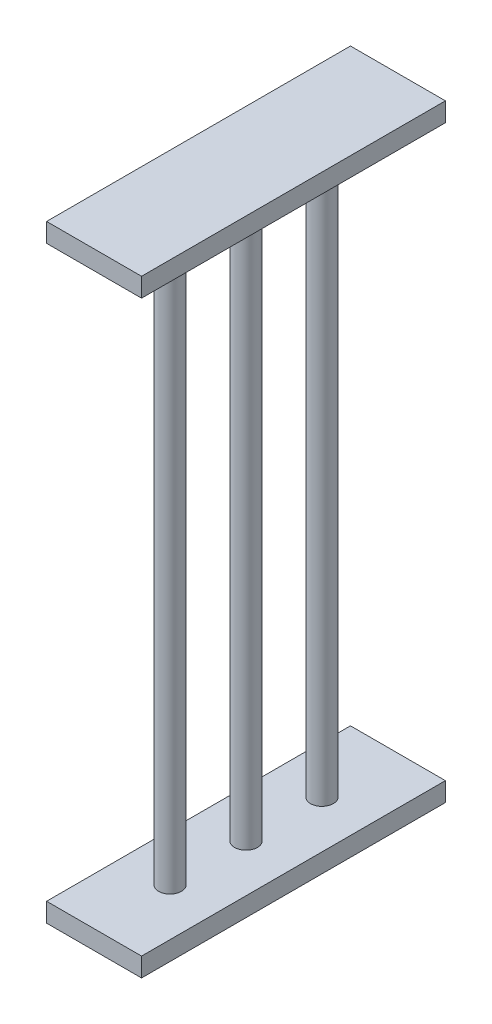
ISO-10303-21;
HEADER;
FILE_DESCRIPTION(('STEP AP214'),'2;1');
FILE_NAME('part.step','',(''),(''),'','','');
FILE_SCHEMA(('AUTOMOTIVE_DESIGN { 1 0 10303 214 1 1 1 1 }'));
ENDSEC;
DATA;
#1=APPLICATION_CONTEXT('core data for automotive mechanical design processes');
#2=APPLICATION_PROTOCOL_DEFINITION('international standard','automotive_design',2000,#1);
#3=PRODUCT_CONTEXT('',#1,'mechanical');
#4=PRODUCT('Part','Part','',(#3));
#5=PRODUCT_RELATED_PRODUCT_CATEGORY('part','',(#4));
#6=PRODUCT_DEFINITION_FORMATION('','',#4);
#7=PRODUCT_DEFINITION_CONTEXT('part definition',#1,'design');
#8=PRODUCT_DEFINITION('design','',#6,#7);
#9=PRODUCT_DEFINITION_SHAPE('','',#8);
#10=(LENGTH_UNIT() NAMED_UNIT(*) SI_UNIT(.MILLI.,.METRE.));
#11=(NAMED_UNIT(*) PLANE_ANGLE_UNIT() SI_UNIT($,.RADIAN.));
#12=(NAMED_UNIT(*) SI_UNIT($,.STERADIAN.) SOLID_ANGLE_UNIT());
#13=UNCERTAINTY_MEASURE_WITH_UNIT(LENGTH_MEASURE(1.E-05),#10,'distance_accuracy_value','');
#14=(GEOMETRIC_REPRESENTATION_CONTEXT(3) GLOBAL_UNCERTAINTY_ASSIGNED_CONTEXT((#13)) GLOBAL_UNIT_ASSIGNED_CONTEXT((#10,
#11,#12)) REPRESENTATION_CONTEXT('',''));
#15=CARTESIAN_POINT('',(0.,0.,0.));
#16=DIRECTION('',(0.,0.,1.));
#17=DIRECTION('',(1.,0.,0.));
#18=AXIS2_PLACEMENT_3D('',#15,#16,#17);
#19=CARTESIAN_POINT('',(0.,10.,0.));
#20=DIRECTION('',(-1.,0.,0.));
#21=DIRECTION('',(0.,0.,1.));
#22=AXIS2_PLACEMENT_3D('',#19,#20,#21);
#23=PLANE('',#22);
#24=DIRECTION('',(0.,0.,-1.));
#25=VECTOR('',#24,1.);
#26=CARTESIAN_POINT('',(0.,0.,0.));
#27=LINE('',#26,#25);
#28=CARTESIAN_POINT('',(0.,0.,0.));
#29=VERTEX_POINT('',#28);
#30=CARTESIAN_POINT('',(0.,0.,-160.));
#31=VERTEX_POINT('',#30);
#32=EDGE_CURVE('E153',#29,#31,#27,.T.);
#33=ORIENTED_EDGE('',*,*,#32,.T.);
#34=DIRECTION('',(0.,-1.,0.));
#35=VECTOR('',#34,1.);
#36=CARTESIAN_POINT('',(0.,10.,-160.));
#37=LINE('',#36,#35);
#38=CARTESIAN_POINT('',(0.,10.,-160.));
#39=VERTEX_POINT('',#38);
#40=EDGE_CURVE('E11',#39,#31,#37,.T.);
#41=ORIENTED_EDGE('',*,*,#40,.F.);
#42=DIRECTION('',(0.,0.,-1.));
#43=VECTOR('',#42,1.);
#44=CARTESIAN_POINT('',(0.,10.,0.));
#45=LINE('',#44,#43);
#46=CARTESIAN_POINT('',(0.,10.,0.));
#47=VERTEX_POINT('',#46);
#48=EDGE_CURVE('E156',#47,#39,#45,.T.);
#49=ORIENTED_EDGE('',*,*,#48,.F.);
#50=DIRECTION('',(0.,-1.,0.));
#51=VECTOR('',#50,1.);
#52=CARTESIAN_POINT('',(0.,10.,0.));
#53=LINE('',#52,#51);
#54=EDGE_CURVE('E162',#47,#29,#53,.T.);
#55=ORIENTED_EDGE('',*,*,#54,.T.);
#56=EDGE_LOOP('',(#33,#41,#49,#55));
#57=FACE_BOUND('',#56,.T.);
#58=ADVANCED_FACE('F33',(#57),#23,.F.);
#59=CARTESIAN_POINT('',(0.,10.,-160.));
#60=DIRECTION('',(0.,0.,1.));
#61=DIRECTION('',(1.,0.,0.));
#62=AXIS2_PLACEMENT_3D('',#59,#60,#61);
#63=PLANE('',#62);
#64=DIRECTION('',(-1.,0.,0.));
#65=VECTOR('',#64,1.);
#66=CARTESIAN_POINT('',(0.,0.,-160.));
#67=LINE('',#66,#65);
#68=CARTESIAN_POINT('',(-50.,0.,-160.));
#69=VERTEX_POINT('',#68);
#70=EDGE_CURVE('E165',#31,#69,#67,.T.);
#71=ORIENTED_EDGE('',*,*,#70,.T.);
#72=DIRECTION('',(0.,-1.,0.));
#73=VECTOR('',#72,1.);
#74=CARTESIAN_POINT('',(-50.,10.,-160.));
#75=LINE('',#74,#73);
#76=CARTESIAN_POINT('',(-50.,10.,-160.));
#77=VERTEX_POINT('',#76);
#78=EDGE_CURVE('E41',#77,#69,#75,.T.);
#79=ORIENTED_EDGE('',*,*,#78,.F.);
#80=DIRECTION('',(-1.,0.,0.));
#81=VECTOR('',#80,1.);
#82=CARTESIAN_POINT('',(0.,10.,-160.));
#83=LINE('',#82,#81);
#84=EDGE_CURVE('E80',#39,#77,#83,.T.);
#85=ORIENTED_EDGE('',*,*,#84,.F.);
#86=ORIENTED_EDGE('',*,*,#40,.T.);
#87=EDGE_LOOP('',(#71,#79,#85,#86));
#88=FACE_BOUND('',#87,.T.);
#89=ADVANCED_FACE('F189',(#88),#63,.F.);
#90=CARTESIAN_POINT('',(-50.,10.,0.));
#91=DIRECTION('',(1.,0.,0.));
#92=DIRECTION('',(0.,0.,-1.));
#93=AXIS2_PLACEMENT_3D('',#90,#91,#92);
#94=PLANE('',#93);
#95=DIRECTION('',(0.,0.,1.));
#96=VECTOR('',#95,1.);
#97=CARTESIAN_POINT('',(-50.,0.,0.));
#98=LINE('',#97,#96);
#99=CARTESIAN_POINT('',(-50.,0.,0.));
#100=VERTEX_POINT('',#99);
#101=EDGE_CURVE('E67',#69,#100,#98,.T.);
#102=ORIENTED_EDGE('',*,*,#101,.T.);
#103=DIRECTION('',(0.,-1.,0.));
#104=VECTOR('',#103,1.);
#105=CARTESIAN_POINT('',(-50.,10.,0.));
#106=LINE('',#105,#104);
#107=CARTESIAN_POINT('',(-50.,10.,0.));
#108=VERTEX_POINT('',#107);
#109=EDGE_CURVE('E170',#108,#100,#106,.T.);
#110=ORIENTED_EDGE('',*,*,#109,.F.);
#111=DIRECTION('',(0.,0.,1.));
#112=VECTOR('',#111,1.);
#113=CARTESIAN_POINT('',(-50.,10.,0.));
#114=LINE('',#113,#112);
#115=EDGE_CURVE('E159',#77,#108,#114,.T.);
#116=ORIENTED_EDGE('',*,*,#115,.F.);
#117=ORIENTED_EDGE('',*,*,#78,.T.);
#118=EDGE_LOOP('',(#102,#110,#116,#117));
#119=FACE_BOUND('',#118,.T.);
#120=ADVANCED_FACE('F172',(#119),#94,.F.);
#121=CARTESIAN_POINT('',(0.,10.,0.));
#122=DIRECTION('',(0.,0.,-1.));
#123=DIRECTION('',(-1.,0.,0.));
#124=AXIS2_PLACEMENT_3D('',#121,#122,#123);
#125=PLANE('',#124);
#126=DIRECTION('',(1.,0.,0.));
#127=VECTOR('',#126,1.);
#128=CARTESIAN_POINT('',(0.,0.,0.));
#129=LINE('',#128,#127);
#130=EDGE_CURVE('E73',#100,#29,#129,.T.);
#131=ORIENTED_EDGE('',*,*,#130,.T.);
#132=ORIENTED_EDGE('',*,*,#54,.F.);
#133=DIRECTION('',(1.,0.,0.));
#134=VECTOR('',#133,1.);
#135=CARTESIAN_POINT('',(0.,10.,0.));
#136=LINE('',#135,#134);
#137=EDGE_CURVE('E49',#108,#47,#136,.T.);
#138=ORIENTED_EDGE('',*,*,#137,.F.);
#139=ORIENTED_EDGE('',*,*,#109,.T.);
#140=EDGE_LOOP('',(#131,#132,#138,#139));
#141=FACE_BOUND('',#140,.T.);
#142=ADVANCED_FACE('F179',(#141),#125,.F.);
#143=CARTESIAN_POINT('',(0.,10.,0.));
#144=DIRECTION('',(0.,1.,0.));
#145=DIRECTION('',(0.,0.,1.));
#146=AXIS2_PLACEMENT_3D('',#143,#144,#145);
#147=PLANE('',#146);
#148=CARTESIAN_POINT('',(-25.,10.,-40.));
#149=DIRECTION('',(0.,1.,0.));
#150=DIRECTION('',(0.,0.,1.));
#151=AXIS2_PLACEMENT_3D('',#148,#149,#150);
#152=CIRCLE('',#151,6.);
#153=CARTESIAN_POINT('',(-25.,10.,-34.));
#154=VERTEX_POINT('',#153);
#155=EDGE_CURVE('E132',#154,#154,#152,.T.);
#156=ORIENTED_EDGE('',*,*,#155,.F.);
#157=EDGE_LOOP('',(#156));
#158=FACE_BOUND('',#157,.T.);
#159=CARTESIAN_POINT('',(-25.,10.,-80.));
#160=DIRECTION('',(0.,1.,0.));
#161=DIRECTION('',(0.,0.,1.));
#162=AXIS2_PLACEMENT_3D('',#159,#160,#161);
#163=CIRCLE('',#162,6.);
#164=CARTESIAN_POINT('',(-25.,10.,-74.));
#165=VERTEX_POINT('',#164);
#166=EDGE_CURVE('E142',#165,#165,#163,.T.);
#167=ORIENTED_EDGE('',*,*,#166,.F.);
#168=EDGE_LOOP('',(#167));
#169=FACE_BOUND('',#168,.T.);
#170=CARTESIAN_POINT('',(-25.,10.,-120.));
#171=DIRECTION('',(0.,1.,0.));
#172=DIRECTION('',(0.,0.,1.));
#173=AXIS2_PLACEMENT_3D('',#170,#171,#172);
#174=CIRCLE('',#173,6.);
#175=CARTESIAN_POINT('',(-25.,10.,-114.));
#176=VERTEX_POINT('',#175);
#177=EDGE_CURVE('E147',#176,#176,#174,.T.);
#178=ORIENTED_EDGE('',*,*,#177,.F.);
#179=EDGE_LOOP('',(#178));
#180=FACE_BOUND('',#179,.T.);
#181=ORIENTED_EDGE('',*,*,#48,.T.);
#182=ORIENTED_EDGE('',*,*,#84,.T.);
#183=ORIENTED_EDGE('',*,*,#115,.T.);
#184=ORIENTED_EDGE('',*,*,#137,.T.);
#185=EDGE_LOOP('',(#181,#182,#183,#184));
#186=FACE_BOUND('',#185,.T.);
#187=ADVANCED_FACE('F181',(#158,#169,#180,#186),#147,.T.);
#188=CARTESIAN_POINT('',(0.,0.,0.));
#189=DIRECTION('',(0.,1.,0.));
#190=DIRECTION('',(0.,0.,1.));
#191=AXIS2_PLACEMENT_3D('',#188,#189,#190);
#192=PLANE('',#191);
#193=ORIENTED_EDGE('',*,*,#32,.F.);
#194=ORIENTED_EDGE('',*,*,#130,.F.);
#195=ORIENTED_EDGE('',*,*,#101,.F.);
#196=ORIENTED_EDGE('',*,*,#70,.F.);
#197=EDGE_LOOP('',(#193,#194,#195,#196));
#198=FACE_BOUND('',#197,.T.);
#199=ADVANCED_FACE('F175',(#198),#192,.F.);
#200=CARTESIAN_POINT('',(-25.,310.,-120.));
#201=DIRECTION('',(0.,-1.,0.));
#202=DIRECTION('',(0.,0.,-1.));
#203=AXIS2_PLACEMENT_3D('',#200,#201,#202);
#204=CYLINDRICAL_SURFACE('',#203,6.);
#205=CARTESIAN_POINT('',(-25.,310.,-120.));
#206=DIRECTION('',(0.,1.,0.));
#207=DIRECTION('',(0.,0.,1.));
#208=AXIS2_PLACEMENT_3D('',#205,#206,#207);
#209=CIRCLE('',#208,6.);
#210=CARTESIAN_POINT('',(-25.,310.,-114.));
#211=VERTEX_POINT('',#210);
#212=EDGE_CURVE('E150',#211,#211,#209,.T.);
#213=ORIENTED_EDGE('',*,*,#212,.F.);
#214=EDGE_LOOP('',(#213));
#215=FACE_BOUND('',#214,.T.);
#216=ORIENTED_EDGE('',*,*,#177,.T.);
#217=EDGE_LOOP('',(#216));
#218=FACE_BOUND('',#217,.T.);
#219=ADVANCED_FACE('F216',(#215,#218),#204,.T.);
#220=CARTESIAN_POINT('',(-25.,310.,-80.));
#221=DIRECTION('',(0.,-1.,0.));
#222=DIRECTION('',(0.,0.,-1.));
#223=AXIS2_PLACEMENT_3D('',#220,#221,#222);
#224=CYLINDRICAL_SURFACE('',#223,6.);
#225=CARTESIAN_POINT('',(-25.,310.,-80.));
#226=DIRECTION('',(0.,1.,0.));
#227=DIRECTION('',(0.,0.,1.));
#228=AXIS2_PLACEMENT_3D('',#225,#226,#227);
#229=CIRCLE('',#228,6.);
#230=CARTESIAN_POINT('',(-25.,310.,-74.));
#231=VERTEX_POINT('',#230);
#232=EDGE_CURVE('E144',#231,#231,#229,.T.);
#233=ORIENTED_EDGE('',*,*,#232,.F.);
#234=EDGE_LOOP('',(#233));
#235=FACE_BOUND('',#234,.T.);
#236=ORIENTED_EDGE('',*,*,#166,.T.);
#237=EDGE_LOOP('',(#236));
#238=FACE_BOUND('',#237,.T.);
#239=ADVANCED_FACE('F229',(#235,#238),#224,.T.);
#240=CARTESIAN_POINT('',(-25.,310.,-40.));
#241=DIRECTION('',(0.,-1.,0.));
#242=DIRECTION('',(0.,0.,-1.));
#243=AXIS2_PLACEMENT_3D('',#240,#241,#242);
#244=CYLINDRICAL_SURFACE('',#243,6.);
#245=CARTESIAN_POINT('',(-25.,310.,-40.));
#246=DIRECTION('',(0.,1.,0.));
#247=DIRECTION('',(0.,0.,1.));
#248=AXIS2_PLACEMENT_3D('',#245,#246,#247);
#249=CIRCLE('',#248,6.);
#250=CARTESIAN_POINT('',(-25.,310.,-34.));
#251=VERTEX_POINT('',#250);
#252=EDGE_CURVE('E135',#251,#251,#249,.T.);
#253=ORIENTED_EDGE('',*,*,#252,.F.);
#254=EDGE_LOOP('',(#253));
#255=FACE_BOUND('',#254,.T.);
#256=ORIENTED_EDGE('',*,*,#155,.T.);
#257=EDGE_LOOP('',(#256));
#258=FACE_BOUND('',#257,.T.);
#259=ADVANCED_FACE('F239',(#255,#258),#244,.T.);
#260=CARTESIAN_POINT('',(-50.,320.,0.));
#261=DIRECTION('',(0.,0.,-1.));
#262=DIRECTION('',(-1.,0.,0.));
#263=AXIS2_PLACEMENT_3D('',#260,#261,#262);
#264=PLANE('',#263);
#265=DIRECTION('',(1.,0.,0.));
#266=VECTOR('',#265,1.);
#267=CARTESIAN_POINT('',(-50.,310.,0.));
#268=LINE('',#267,#266);
#269=CARTESIAN_POINT('',(-50.,310.,0.));
#270=VERTEX_POINT('',#269);
#271=CARTESIAN_POINT('',(0.,310.,0.));
#272=VERTEX_POINT('',#271);
#273=EDGE_CURVE('E131',#270,#272,#268,.T.);
#274=ORIENTED_EDGE('',*,*,#273,.T.);
#275=DIRECTION('',(0.,-1.,0.));
#276=VECTOR('',#275,1.);
#277=CARTESIAN_POINT('',(0.,320.,0.));
#278=LINE('',#277,#276);
#279=CARTESIAN_POINT('',(0.,320.,0.));
#280=VERTEX_POINT('',#279);
#281=EDGE_CURVE('E111',#280,#272,#278,.T.);
#282=ORIENTED_EDGE('',*,*,#281,.F.);
#283=DIRECTION('',(1.,0.,0.));
#284=VECTOR('',#283,1.);
#285=CARTESIAN_POINT('',(-50.,320.,0.));
#286=LINE('',#285,#284);
#287=CARTESIAN_POINT('',(-50.,320.,0.));
#288=VERTEX_POINT('',#287);
#289=EDGE_CURVE('E118',#288,#280,#286,.T.);
#290=ORIENTED_EDGE('',*,*,#289,.F.);
#291=DIRECTION('',(0.,-1.,0.));
#292=VECTOR('',#291,1.);
#293=CARTESIAN_POINT('',(-50.,320.,0.));
#294=LINE('',#293,#292);
#295=EDGE_CURVE('E324',#288,#270,#294,.T.);
#296=ORIENTED_EDGE('',*,*,#295,.T.);
#297=EDGE_LOOP('',(#274,#282,#290,#296));
#298=FACE_BOUND('',#297,.T.);
#299=ADVANCED_FACE('F129',(#298),#264,.F.);
#300=CARTESIAN_POINT('',(0.,320.,0.));
#301=DIRECTION('',(-1.,0.,0.));
#302=DIRECTION('',(0.,0.,1.));
#303=AXIS2_PLACEMENT_3D('',#300,#301,#302);
#304=PLANE('',#303);
#305=DIRECTION('',(0.,0.,-1.));
#306=VECTOR('',#305,1.);
#307=CARTESIAN_POINT('',(0.,310.,0.));
#308=LINE('',#307,#306);
#309=CARTESIAN_POINT('',(0.,310.,-160.));
#310=VERTEX_POINT('',#309);
#311=EDGE_CURVE('E315',#272,#310,#308,.T.);
#312=ORIENTED_EDGE('',*,*,#311,.T.);
#313=DIRECTION('',(0.,-1.,0.));
#314=VECTOR('',#313,1.);
#315=CARTESIAN_POINT('',(0.,320.,-160.));
#316=LINE('',#315,#314);
#317=CARTESIAN_POINT('',(0.,320.,-160.));
#318=VERTEX_POINT('',#317);
#319=EDGE_CURVE('E114',#318,#310,#316,.T.);
#320=ORIENTED_EDGE('',*,*,#319,.F.);
#321=DIRECTION('',(0.,0.,-1.));
#322=VECTOR('',#321,1.);
#323=CARTESIAN_POINT('',(0.,320.,0.));
#324=LINE('',#323,#322);
#325=EDGE_CURVE('E107',#280,#318,#324,.T.);
#326=ORIENTED_EDGE('',*,*,#325,.F.);
#327=ORIENTED_EDGE('',*,*,#281,.T.);
#328=EDGE_LOOP('',(#312,#320,#326,#327));
#329=FACE_BOUND('',#328,.T.);
#330=ADVANCED_FACE('F109',(#329),#304,.F.);
#331=CARTESIAN_POINT('',(0.,320.,-160.));
#332=DIRECTION('',(0.,0.,1.));
#333=DIRECTION('',(1.,0.,0.));
#334=AXIS2_PLACEMENT_3D('',#331,#332,#333);
#335=PLANE('',#334);
#336=DIRECTION('',(-1.,0.,0.));
#337=VECTOR('',#336,1.);
#338=CARTESIAN_POINT('',(0.,310.,-160.));
#339=LINE('',#338,#337);
#340=CARTESIAN_POINT('',(-50.,310.,-160.));
#341=VERTEX_POINT('',#340);
#342=EDGE_CURVE('E317',#310,#341,#339,.T.);
#343=ORIENTED_EDGE('',*,*,#342,.T.);
#344=DIRECTION('',(0.,-1.,0.));
#345=VECTOR('',#344,1.);
#346=CARTESIAN_POINT('',(-50.,320.,-160.));
#347=LINE('',#346,#345);
#348=CARTESIAN_POINT('',(-50.,320.,-160.));
#349=VERTEX_POINT('',#348);
#350=EDGE_CURVE('E137',#349,#341,#347,.T.);
#351=ORIENTED_EDGE('',*,*,#350,.F.);
#352=DIRECTION('',(-1.,0.,0.));
#353=VECTOR('',#352,1.);
#354=CARTESIAN_POINT('',(0.,320.,-160.));
#355=LINE('',#354,#353);
#356=EDGE_CURVE('E117',#318,#349,#355,.T.);
#357=ORIENTED_EDGE('',*,*,#356,.F.);
#358=ORIENTED_EDGE('',*,*,#319,.T.);
#359=EDGE_LOOP('',(#343,#351,#357,#358));
#360=FACE_BOUND('',#359,.T.);
#361=ADVANCED_FACE('F266',(#360),#335,.F.);
#362=CARTESIAN_POINT('',(-50.,320.,-160.));
#363=DIRECTION('',(1.,0.,0.));
#364=DIRECTION('',(0.,0.,-1.));
#365=AXIS2_PLACEMENT_3D('',#362,#363,#364);
#366=PLANE('',#365);
#367=DIRECTION('',(0.,0.,1.));
#368=VECTOR('',#367,1.);
#369=CARTESIAN_POINT('',(-50.,310.,-160.));
#370=LINE('',#369,#368);
#371=EDGE_CURVE('E127',#341,#270,#370,.T.);
#372=ORIENTED_EDGE('',*,*,#371,.T.);
#373=ORIENTED_EDGE('',*,*,#295,.F.);
#374=DIRECTION('',(0.,0.,1.));
#375=VECTOR('',#374,1.);
#376=CARTESIAN_POINT('',(-50.,320.,-160.));
#377=LINE('',#376,#375);
#378=EDGE_CURVE('E123',#349,#288,#377,.T.);
#379=ORIENTED_EDGE('',*,*,#378,.F.);
#380=ORIENTED_EDGE('',*,*,#350,.T.);
#381=EDGE_LOOP('',(#372,#373,#379,#380));
#382=FACE_BOUND('',#381,.T.);
#383=ADVANCED_FACE('F275',(#382),#366,.F.);
#384=CARTESIAN_POINT('',(0.,320.,0.));
#385=DIRECTION('',(0.,1.,0.));
#386=DIRECTION('',(0.,0.,1.));
#387=AXIS2_PLACEMENT_3D('',#384,#385,#386);
#388=PLANE('',#387);
#389=ORIENTED_EDGE('',*,*,#289,.T.);
#390=ORIENTED_EDGE('',*,*,#325,.T.);
#391=ORIENTED_EDGE('',*,*,#356,.T.);
#392=ORIENTED_EDGE('',*,*,#378,.T.);
#393=EDGE_LOOP('',(#389,#390,#391,#392));
#394=FACE_BOUND('',#393,.T.);
#395=ADVANCED_FACE('F121',(#394),#388,.T.);
#396=CARTESIAN_POINT('',(0.,310.,0.));
#397=DIRECTION('',(0.,1.,0.));
#398=DIRECTION('',(0.,0.,1.));
#399=AXIS2_PLACEMENT_3D('',#396,#397,#398);
#400=PLANE('',#399);
#401=ORIENTED_EDGE('',*,*,#212,.T.);
#402=EDGE_LOOP('',(#401));
#403=FACE_BOUND('',#402,.T.);
#404=ORIENTED_EDGE('',*,*,#232,.T.);
#405=EDGE_LOOP('',(#404));
#406=FACE_BOUND('',#405,.T.);
#407=ORIENTED_EDGE('',*,*,#252,.T.);
#408=EDGE_LOOP('',(#407));
#409=FACE_BOUND('',#408,.T.);
#410=ORIENTED_EDGE('',*,*,#273,.F.);
#411=ORIENTED_EDGE('',*,*,#371,.F.);
#412=ORIENTED_EDGE('',*,*,#342,.F.);
#413=ORIENTED_EDGE('',*,*,#311,.F.);
#414=EDGE_LOOP('',(#410,#411,#412,#413));
#415=FACE_BOUND('',#414,.T.);
#416=ADVANCED_FACE('F294',(#403,#406,#409,#415),#400,.F.);
#417=CLOSED_SHELL('',(#58,#89,#120,#142,#187,#199,#219,#239,#259,#299,#330,#361,#383,#395,#416));
#418=MANIFOLD_SOLID_BREP('B2',#417);
#419=ADVANCED_BREP_SHAPE_REPRESENTATION('',(#18,#418),#14);
#420=SHAPE_DEFINITION_REPRESENTATION(#9,#419);
ENDSEC;
END-ISO-10303-21;
